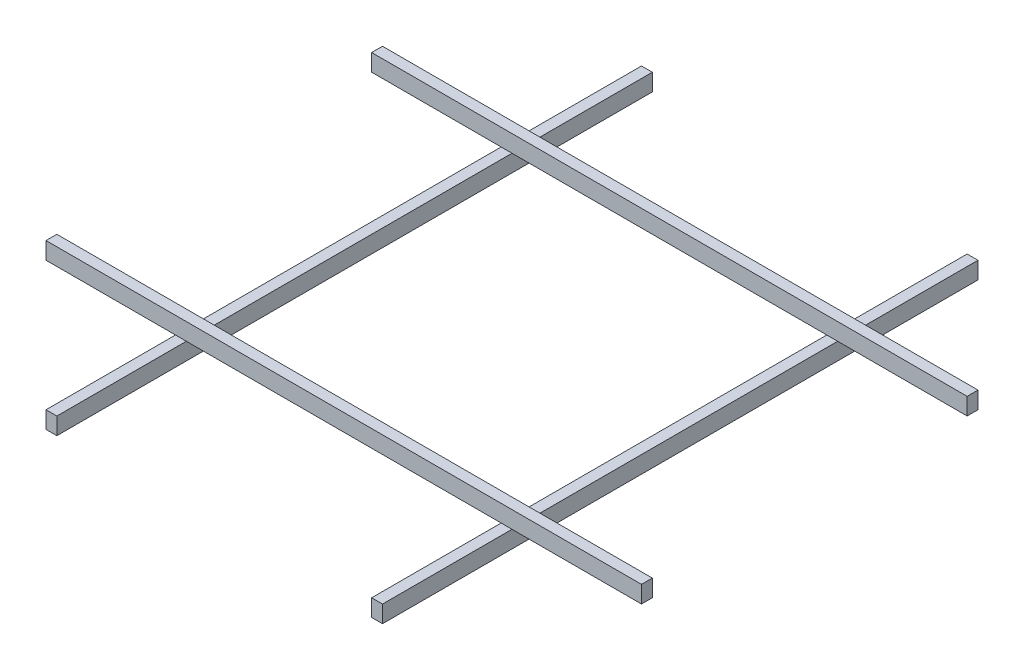
ISO-10303-21;
HEADER;
FILE_DESCRIPTION(('STEP AP214'),'2;1');
FILE_NAME('part.step','',(''),(''),'','','');
FILE_SCHEMA(('AUTOMOTIVE_DESIGN { 1 0 10303 214 1 1 1 1 }'));
ENDSEC;
DATA;
#1=APPLICATION_CONTEXT('core data for automotive mechanical design processes');
#2=APPLICATION_PROTOCOL_DEFINITION('international standard','automotive_design',2000,#1);
#3=PRODUCT_CONTEXT('',#1,'mechanical');
#4=PRODUCT('Part','Part','',(#3));
#5=PRODUCT_RELATED_PRODUCT_CATEGORY('part','',(#4));
#6=PRODUCT_DEFINITION_FORMATION('','',#4);
#7=PRODUCT_DEFINITION_CONTEXT('part definition',#1,'design');
#8=PRODUCT_DEFINITION('design','',#6,#7);
#9=PRODUCT_DEFINITION_SHAPE('','',#8);
#10=(LENGTH_UNIT() NAMED_UNIT(*) SI_UNIT(.MILLI.,.METRE.));
#11=(NAMED_UNIT(*) PLANE_ANGLE_UNIT() SI_UNIT($,.RADIAN.));
#12=(NAMED_UNIT(*) SI_UNIT($,.STERADIAN.) SOLID_ANGLE_UNIT());
#13=UNCERTAINTY_MEASURE_WITH_UNIT(LENGTH_MEASURE(1.E-05),#10,'distance_accuracy_value','');
#14=(GEOMETRIC_REPRESENTATION_CONTEXT(3) GLOBAL_UNCERTAINTY_ASSIGNED_CONTEXT((#13)) GLOBAL_UNIT_ASSIGNED_CONTEXT((#10,
#11,#12)) REPRESENTATION_CONTEXT('',''));
#15=CARTESIAN_POINT('',(0.,0.,0.));
#16=DIRECTION('',(0.,0.,1.));
#17=DIRECTION('',(1.,0.,0.));
#18=AXIS2_PLACEMENT_3D('',#15,#16,#17);
#19=CARTESIAN_POINT('',(4572.,209.55,-1149.35));
#20=DIRECTION('',(0.,0.,1.));
#21=DIRECTION('',(1.,0.,0.));
#22=AXIS2_PLACEMENT_3D('',#19,#20,#21);
#23=PLANE('',#22);
#24=DIRECTION('',(0.,1.,0.));
#25=VECTOR('',#24,1.);
#26=CARTESIAN_POINT('',(-304.8,209.55,-1149.35));
#27=LINE('',#26,#25);
#28=CARTESIAN_POINT('',(-304.8,69.85,-1149.35));
#29=VERTEX_POINT('',#28);
#30=CARTESIAN_POINT('',(-304.8,209.55,-1149.35));
#31=VERTEX_POINT('',#30);
#32=EDGE_CURVE('E137',#29,#31,#27,.T.);
#33=ORIENTED_EDGE('',*,*,#32,.T.);
#34=DIRECTION('',(-1.,0.,0.));
#35=VECTOR('',#34,1.);
#36=CARTESIAN_POINT('',(4572.,209.55,-1149.35));
#37=LINE('',#36,#35);
#38=CARTESIAN_POINT('',(4572.,209.55,-1149.35));
#39=VERTEX_POINT('',#38);
#40=EDGE_CURVE('E13',#39,#31,#37,.T.);
#41=ORIENTED_EDGE('',*,*,#40,.F.);
#42=DIRECTION('',(0.,1.,0.));
#43=VECTOR('',#42,1.);
#44=CARTESIAN_POINT('',(4572.,209.55,-1149.35));
#45=LINE('',#44,#43);
#46=CARTESIAN_POINT('',(4572.,69.85,-1149.35));
#47=VERTEX_POINT('',#46);
#48=EDGE_CURVE('E124',#47,#39,#45,.T.);
#49=ORIENTED_EDGE('',*,*,#48,.F.);
#50=DIRECTION('',(-1.,0.,0.));
#51=VECTOR('',#50,1.);
#52=CARTESIAN_POINT('',(4572.,69.85,-1149.35));
#53=LINE('',#52,#51);
#54=EDGE_CURVE('E133',#47,#29,#53,.T.);
#55=ORIENTED_EDGE('',*,*,#54,.T.);
#56=EDGE_LOOP('',(#33,#41,#49,#55));
#57=FACE_BOUND('',#56,.T.);
#58=ADVANCED_FACE('F72',(#57),#23,.F.);
#59=CARTESIAN_POINT('',(4572.,209.55,-1060.45));
#60=DIRECTION('',(0.,-1.,0.));
#61=DIRECTION('',(0.,0.,-1.));
#62=AXIS2_PLACEMENT_3D('',#59,#60,#61);
#63=PLANE('',#62);
#64=DIRECTION('',(0.,0.,1.));
#65=VECTOR('',#64,1.);
#66=CARTESIAN_POINT('',(-304.8,209.55,-1060.45));
#67=LINE('',#66,#65);
#68=CARTESIAN_POINT('',(-304.8,209.55,-1060.45));
#69=VERTEX_POINT('',#68);
#70=EDGE_CURVE('E128',#31,#69,#67,.T.);
#71=ORIENTED_EDGE('',*,*,#70,.T.);
#72=DIRECTION('',(-1.,0.,0.));
#73=VECTOR('',#72,1.);
#74=CARTESIAN_POINT('',(4572.,209.55,-1060.45));
#75=LINE('',#74,#73);
#76=CARTESIAN_POINT('',(4572.,209.55,-1060.45));
#77=VERTEX_POINT('',#76);
#78=EDGE_CURVE('E81',#77,#69,#75,.T.);
#79=ORIENTED_EDGE('',*,*,#78,.F.);
#80=DIRECTION('',(0.,0.,1.));
#81=VECTOR('',#80,1.);
#82=CARTESIAN_POINT('',(4572.,209.55,-1060.45));
#83=LINE('',#82,#81);
#84=EDGE_CURVE('E119',#39,#77,#83,.T.);
#85=ORIENTED_EDGE('',*,*,#84,.F.);
#86=ORIENTED_EDGE('',*,*,#40,.T.);
#87=EDGE_LOOP('',(#71,#79,#85,#86));
#88=FACE_BOUND('',#87,.T.);
#89=ADVANCED_FACE('F127',(#88),#63,.F.);
#90=CARTESIAN_POINT('',(4572.,209.55,-1060.45));
#91=DIRECTION('',(0.,0.,-1.));
#92=DIRECTION('',(-1.,0.,0.));
#93=AXIS2_PLACEMENT_3D('',#90,#91,#92);
#94=PLANE('',#93);
#95=DIRECTION('',(0.,-1.,0.));
#96=VECTOR('',#95,1.);
#97=CARTESIAN_POINT('',(-304.8,209.55,-1060.45));
#98=LINE('',#97,#96);
#99=CARTESIAN_POINT('',(-304.8,69.85,-1060.45));
#100=VERTEX_POINT('',#99);
#101=EDGE_CURVE('E106',#69,#100,#98,.T.);
#102=ORIENTED_EDGE('',*,*,#101,.T.);
#103=DIRECTION('',(-1.,0.,0.));
#104=VECTOR('',#103,1.);
#105=CARTESIAN_POINT('',(4572.,69.85,-1060.45));
#106=LINE('',#105,#104);
#107=CARTESIAN_POINT('',(4572.,69.85,-1060.45));
#108=VERTEX_POINT('',#107);
#109=EDGE_CURVE('E130',#108,#100,#106,.T.);
#110=ORIENTED_EDGE('',*,*,#109,.F.);
#111=DIRECTION('',(0.,-1.,0.));
#112=VECTOR('',#111,1.);
#113=CARTESIAN_POINT('',(4572.,209.55,-1060.45));
#114=LINE('',#113,#112);
#115=EDGE_CURVE('E122',#77,#108,#114,.T.);
#116=ORIENTED_EDGE('',*,*,#115,.F.);
#117=ORIENTED_EDGE('',*,*,#78,.T.);
#118=EDGE_LOOP('',(#102,#110,#116,#117));
#119=FACE_BOUND('',#118,.T.);
#120=ADVANCED_FACE('F131',(#119),#94,.F.);
#121=CARTESIAN_POINT('',(4572.,69.85,-1060.45));
#122=DIRECTION('',(0.,1.,0.));
#123=DIRECTION('',(0.,0.,1.));
#124=AXIS2_PLACEMENT_3D('',#121,#122,#123);
#125=PLANE('',#124);
#126=DIRECTION('',(0.,0.,-1.));
#127=VECTOR('',#126,1.);
#128=CARTESIAN_POINT('',(-304.8,69.85,-1060.45));
#129=LINE('',#128,#127);
#130=EDGE_CURVE('E112',#100,#29,#129,.T.);
#131=ORIENTED_EDGE('',*,*,#130,.T.);
#132=ORIENTED_EDGE('',*,*,#54,.F.);
#133=DIRECTION('',(0.,0.,-1.));
#134=VECTOR('',#133,1.);
#135=CARTESIAN_POINT('',(4572.,69.85,-1060.45));
#136=LINE('',#135,#134);
#137=EDGE_CURVE('E89',#108,#47,#136,.T.);
#138=ORIENTED_EDGE('',*,*,#137,.F.);
#139=ORIENTED_EDGE('',*,*,#109,.T.);
#140=EDGE_LOOP('',(#131,#132,#138,#139));
#141=FACE_BOUND('',#140,.T.);
#142=ADVANCED_FACE('F146',(#141),#125,.F.);
#143=CARTESIAN_POINT('',(4572.,139.7,-1905.));
#144=DIRECTION('',(1.,0.,0.));
#145=DIRECTION('',(0.,0.,-1.));
#146=AXIS2_PLACEMENT_3D('',#143,#144,#145);
#147=PLANE('',#146);
#148=ORIENTED_EDGE('',*,*,#48,.T.);
#149=ORIENTED_EDGE('',*,*,#84,.T.);
#150=ORIENTED_EDGE('',*,*,#115,.T.);
#151=ORIENTED_EDGE('',*,*,#137,.T.);
#152=EDGE_LOOP('',(#148,#149,#150,#151));
#153=FACE_BOUND('',#152,.T.);
#154=ADVANCED_FACE('F120',(#153),#147,.T.);
#155=CARTESIAN_POINT('',(-304.8,139.7,-1905.));
#156=DIRECTION('',(1.,0.,0.));
#157=DIRECTION('',(0.,0.,-1.));
#158=AXIS2_PLACEMENT_3D('',#155,#156,#157);
#159=PLANE('',#158);
#160=ORIENTED_EDGE('',*,*,#32,.F.);
#161=ORIENTED_EDGE('',*,*,#130,.F.);
#162=ORIENTED_EDGE('',*,*,#101,.F.);
#163=ORIENTED_EDGE('',*,*,#70,.F.);
#164=EDGE_LOOP('',(#160,#161,#162,#163));
#165=FACE_BOUND('',#164,.T.);
#166=ADVANCED_FACE('F149',(#165),#159,.F.);
#167=CLOSED_SHELL('',(#58,#89,#120,#142,#154,#166));
#168=MANIFOLD_SOLID_BREP('B2',#167);
#169=CARTESIAN_POINT('',(4572.,209.55,-3816.35));
#170=DIRECTION('',(0.,0.,1.));
#171=DIRECTION('',(1.,0.,0.));
#172=AXIS2_PLACEMENT_3D('',#169,#170,#171);
#173=PLANE('',#172);
#174=DIRECTION('',(0.,1.,0.));
#175=VECTOR('',#174,1.);
#176=CARTESIAN_POINT('',(-304.8,209.55,-3816.35));
#177=LINE('',#176,#175);
#178=CARTESIAN_POINT('',(-304.8,69.85,-3816.35));
#179=VERTEX_POINT('',#178);
#180=CARTESIAN_POINT('',(-304.8,209.55,-3816.35));
#181=VERTEX_POINT('',#180);
#182=EDGE_CURVE('E301',#179,#181,#177,.T.);
#183=ORIENTED_EDGE('',*,*,#182,.T.);
#184=DIRECTION('',(-1.,0.,0.));
#185=VECTOR('',#184,1.);
#186=CARTESIAN_POINT('',(4572.,209.55,-3816.35));
#187=LINE('',#186,#185);
#188=CARTESIAN_POINT('',(4572.,209.55,-3816.35));
#189=VERTEX_POINT('',#188);
#190=EDGE_CURVE('E70',#189,#181,#187,.T.);
#191=ORIENTED_EDGE('',*,*,#190,.F.);
#192=DIRECTION('',(0.,1.,0.));
#193=VECTOR('',#192,1.);
#194=CARTESIAN_POINT('',(4572.,209.55,-3816.35));
#195=LINE('',#194,#193);
#196=CARTESIAN_POINT('',(4572.,69.85,-3816.35));
#197=VERTEX_POINT('',#196);
#198=EDGE_CURVE('E288',#197,#189,#195,.T.);
#199=ORIENTED_EDGE('',*,*,#198,.F.);
#200=DIRECTION('',(-1.,0.,0.));
#201=VECTOR('',#200,1.);
#202=CARTESIAN_POINT('',(4572.,69.85,-3816.35));
#203=LINE('',#202,#201);
#204=EDGE_CURVE('E297',#197,#179,#203,.T.);
#205=ORIENTED_EDGE('',*,*,#204,.T.);
#206=EDGE_LOOP('',(#183,#191,#199,#205));
#207=FACE_BOUND('',#206,.T.);
#208=ADVANCED_FACE('F236',(#207),#173,.F.);
#209=CARTESIAN_POINT('',(4572.,209.55,-3727.45));
#210=DIRECTION('',(0.,-1.,0.));
#211=DIRECTION('',(0.,0.,-1.));
#212=AXIS2_PLACEMENT_3D('',#209,#210,#211);
#213=PLANE('',#212);
#214=DIRECTION('',(0.,0.,1.));
#215=VECTOR('',#214,1.);
#216=CARTESIAN_POINT('',(-304.8,209.55,-3727.45));
#217=LINE('',#216,#215);
#218=CARTESIAN_POINT('',(-304.8,209.55,-3727.45));
#219=VERTEX_POINT('',#218);
#220=EDGE_CURVE('E292',#181,#219,#217,.T.);
#221=ORIENTED_EDGE('',*,*,#220,.T.);
#222=DIRECTION('',(-1.,0.,0.));
#223=VECTOR('',#222,1.);
#224=CARTESIAN_POINT('',(4572.,209.55,-3727.45));
#225=LINE('',#224,#223);
#226=CARTESIAN_POINT('',(4572.,209.55,-3727.45));
#227=VERTEX_POINT('',#226);
#228=EDGE_CURVE('E245',#227,#219,#225,.T.);
#229=ORIENTED_EDGE('',*,*,#228,.F.);
#230=DIRECTION('',(0.,0.,1.));
#231=VECTOR('',#230,1.);
#232=CARTESIAN_POINT('',(4572.,209.55,-3727.45));
#233=LINE('',#232,#231);
#234=EDGE_CURVE('E283',#189,#227,#233,.T.);
#235=ORIENTED_EDGE('',*,*,#234,.F.);
#236=ORIENTED_EDGE('',*,*,#190,.T.);
#237=EDGE_LOOP('',(#221,#229,#235,#236));
#238=FACE_BOUND('',#237,.T.);
#239=ADVANCED_FACE('F291',(#238),#213,.F.);
#240=CARTESIAN_POINT('',(4572.,209.55,-3727.45));
#241=DIRECTION('',(0.,0.,-1.));
#242=DIRECTION('',(-1.,0.,0.));
#243=AXIS2_PLACEMENT_3D('',#240,#241,#242);
#244=PLANE('',#243);
#245=DIRECTION('',(0.,-1.,0.));
#246=VECTOR('',#245,1.);
#247=CARTESIAN_POINT('',(-304.8,209.55,-3727.45));
#248=LINE('',#247,#246);
#249=CARTESIAN_POINT('',(-304.8,69.85,-3727.45));
#250=VERTEX_POINT('',#249);
#251=EDGE_CURVE('E270',#219,#250,#248,.T.);
#252=ORIENTED_EDGE('',*,*,#251,.T.);
#253=DIRECTION('',(-1.,0.,0.));
#254=VECTOR('',#253,1.);
#255=CARTESIAN_POINT('',(4572.,69.85,-3727.45));
#256=LINE('',#255,#254);
#257=CARTESIAN_POINT('',(4572.,69.85,-3727.45));
#258=VERTEX_POINT('',#257);
#259=EDGE_CURVE('E294',#258,#250,#256,.T.);
#260=ORIENTED_EDGE('',*,*,#259,.F.);
#261=DIRECTION('',(0.,-1.,0.));
#262=VECTOR('',#261,1.);
#263=CARTESIAN_POINT('',(4572.,209.55,-3727.45));
#264=LINE('',#263,#262);
#265=EDGE_CURVE('E286',#227,#258,#264,.T.);
#266=ORIENTED_EDGE('',*,*,#265,.F.);
#267=ORIENTED_EDGE('',*,*,#228,.T.);
#268=EDGE_LOOP('',(#252,#260,#266,#267));
#269=FACE_BOUND('',#268,.T.);
#270=ADVANCED_FACE('F295',(#269),#244,.F.);
#271=CARTESIAN_POINT('',(4572.,69.85,-3727.45));
#272=DIRECTION('',(0.,1.,0.));
#273=DIRECTION('',(0.,0.,1.));
#274=AXIS2_PLACEMENT_3D('',#271,#272,#273);
#275=PLANE('',#274);
#276=DIRECTION('',(0.,0.,-1.));
#277=VECTOR('',#276,1.);
#278=CARTESIAN_POINT('',(-304.8,69.85,-3727.45));
#279=LINE('',#278,#277);
#280=EDGE_CURVE('E276',#250,#179,#279,.T.);
#281=ORIENTED_EDGE('',*,*,#280,.T.);
#282=ORIENTED_EDGE('',*,*,#204,.F.);
#283=DIRECTION('',(0.,0.,-1.));
#284=VECTOR('',#283,1.);
#285=CARTESIAN_POINT('',(4572.,69.85,-3727.45));
#286=LINE('',#285,#284);
#287=EDGE_CURVE('E253',#258,#197,#286,.T.);
#288=ORIENTED_EDGE('',*,*,#287,.F.);
#289=ORIENTED_EDGE('',*,*,#259,.T.);
#290=EDGE_LOOP('',(#281,#282,#288,#289));
#291=FACE_BOUND('',#290,.T.);
#292=ADVANCED_FACE('F308',(#291),#275,.F.);
#293=CARTESIAN_POINT('',(4572.,139.7,-4572.));
#294=DIRECTION('',(1.,0.,0.));
#295=DIRECTION('',(0.,0.,-1.));
#296=AXIS2_PLACEMENT_3D('',#293,#294,#295);
#297=PLANE('',#296);
#298=ORIENTED_EDGE('',*,*,#198,.T.);
#299=ORIENTED_EDGE('',*,*,#234,.T.);
#300=ORIENTED_EDGE('',*,*,#265,.T.);
#301=ORIENTED_EDGE('',*,*,#287,.T.);
#302=EDGE_LOOP('',(#298,#299,#300,#301));
#303=FACE_BOUND('',#302,.T.);
#304=ADVANCED_FACE('F284',(#303),#297,.T.);
#305=CARTESIAN_POINT('',(-304.8,139.7,-4572.));
#306=DIRECTION('',(1.,0.,0.));
#307=DIRECTION('',(0.,0.,-1.));
#308=AXIS2_PLACEMENT_3D('',#305,#306,#307);
#309=PLANE('',#308);
#310=ORIENTED_EDGE('',*,*,#182,.F.);
#311=ORIENTED_EDGE('',*,*,#280,.F.);
#312=ORIENTED_EDGE('',*,*,#251,.F.);
#313=ORIENTED_EDGE('',*,*,#220,.F.);
#314=EDGE_LOOP('',(#310,#311,#312,#313));
#315=FACE_BOUND('',#314,.T.);
#316=ADVANCED_FACE('F311',(#315),#309,.F.);
#317=CLOSED_SHELL('',(#208,#239,#270,#292,#304,#316));
#318=MANIFOLD_SOLID_BREP('B7',#317);
#319=CARTESIAN_POINT('',(3422.65,69.85,-4876.8));
#320=DIRECTION('',(1.,0.,0.));
#321=DIRECTION('',(0.,0.,-1.));
#322=AXIS2_PLACEMENT_3D('',#319,#320,#321);
#323=PLANE('',#322);
#324=DIRECTION('',(0.,1.,0.));
#325=VECTOR('',#324,1.);
#326=CARTESIAN_POINT('',(3422.65,69.85,1.46975985599669E-13));
#327=LINE('',#326,#325);
#328=CARTESIAN_POINT('',(3422.65,-69.85,1.46975985599669E-13));
#329=VERTEX_POINT('',#328);
#330=CARTESIAN_POINT('',(3422.65,69.85,1.46975985599669E-13));
#331=VERTEX_POINT('',#330);
#332=EDGE_CURVE('E458',#329,#331,#327,.T.);
#333=ORIENTED_EDGE('',*,*,#332,.T.);
#334=DIRECTION('',(0.,0.,1.));
#335=VECTOR('',#334,1.);
#336=CARTESIAN_POINT('',(3422.65,69.85,-4876.8));
#337=LINE('',#336,#335);
#338=CARTESIAN_POINT('',(3422.65,69.85,-4876.8));
#339=VERTEX_POINT('',#338);
#340=EDGE_CURVE('E234',#339,#331,#337,.T.);
#341=ORIENTED_EDGE('',*,*,#340,.F.);
#342=DIRECTION('',(0.,1.,0.));
#343=VECTOR('',#342,1.);
#344=CARTESIAN_POINT('',(3422.65,69.85,-4876.8));
#345=LINE('',#344,#343);
#346=CARTESIAN_POINT('',(3422.65,-69.85,-4876.8));
#347=VERTEX_POINT('',#346);
#348=EDGE_CURVE('E446',#347,#339,#345,.T.);
#349=ORIENTED_EDGE('',*,*,#348,.F.);
#350=DIRECTION('',(0.,0.,1.));
#351=VECTOR('',#350,1.);
#352=CARTESIAN_POINT('',(3422.65,-69.85,-4876.8));
#353=LINE('',#352,#351);
#354=EDGE_CURVE('E454',#347,#329,#353,.T.);
#355=ORIENTED_EDGE('',*,*,#354,.T.);
#356=EDGE_LOOP('',(#333,#341,#349,#355));
#357=FACE_BOUND('',#356,.T.);
#358=ADVANCED_FACE('F395',(#357),#323,.F.);
#359=CARTESIAN_POINT('',(3511.55,69.85,-4876.8));
#360=DIRECTION('',(0.,-1.,0.));
#361=DIRECTION('',(0.,0.,-1.));
#362=AXIS2_PLACEMENT_3D('',#359,#360,#361);
#363=PLANE('',#362);
#364=DIRECTION('',(1.,0.,0.));
#365=VECTOR('',#364,1.);
#366=CARTESIAN_POINT('',(3511.55,69.85,1.46975985599669E-13));
#367=LINE('',#366,#365);
#368=CARTESIAN_POINT('',(3511.55,69.85,1.46975985599669E-13));
#369=VERTEX_POINT('',#368);
#370=EDGE_CURVE('E450',#331,#369,#367,.T.);
#371=ORIENTED_EDGE('',*,*,#370,.T.);
#372=DIRECTION('',(0.,0.,1.));
#373=VECTOR('',#372,1.);
#374=CARTESIAN_POINT('',(3511.55,69.85,-4876.8));
#375=LINE('',#374,#373);
#376=CARTESIAN_POINT('',(3511.55,69.85,-4876.8));
#377=VERTEX_POINT('',#376);
#378=EDGE_CURVE('E403',#377,#369,#375,.T.);
#379=ORIENTED_EDGE('',*,*,#378,.F.);
#380=DIRECTION('',(1.,0.,0.));
#381=VECTOR('',#380,1.);
#382=CARTESIAN_POINT('',(3511.55,69.85,-4876.8));
#383=LINE('',#382,#381);
#384=EDGE_CURVE('E441',#339,#377,#383,.T.);
#385=ORIENTED_EDGE('',*,*,#384,.F.);
#386=ORIENTED_EDGE('',*,*,#340,.T.);
#387=EDGE_LOOP('',(#371,#379,#385,#386));
#388=FACE_BOUND('',#387,.T.);
#389=ADVANCED_FACE('F449',(#388),#363,.F.);
#390=CARTESIAN_POINT('',(3511.55,69.85,-4876.8));
#391=DIRECTION('',(-1.,0.,0.));
#392=DIRECTION('',(0.,0.,1.));
#393=AXIS2_PLACEMENT_3D('',#390,#391,#392);
#394=PLANE('',#393);
#395=DIRECTION('',(0.,-1.,0.));
#396=VECTOR('',#395,1.);
#397=CARTESIAN_POINT('',(3511.55,69.85,1.46975985599669E-13));
#398=LINE('',#397,#396);
#399=CARTESIAN_POINT('',(3511.55,-69.85,1.46975985599669E-13));
#400=VERTEX_POINT('',#399);
#401=EDGE_CURVE('E428',#369,#400,#398,.T.);
#402=ORIENTED_EDGE('',*,*,#401,.T.);
#403=DIRECTION('',(0.,0.,1.));
#404=VECTOR('',#403,1.);
#405=CARTESIAN_POINT('',(3511.55,-69.85,-4876.8));
#406=LINE('',#405,#404);
#407=CARTESIAN_POINT('',(3511.55,-69.85,-4876.8));
#408=VERTEX_POINT('',#407);
#409=EDGE_CURVE('E451',#408,#400,#406,.T.);
#410=ORIENTED_EDGE('',*,*,#409,.F.);
#411=DIRECTION('',(0.,-1.,0.));
#412=VECTOR('',#411,1.);
#413=CARTESIAN_POINT('',(3511.55,69.85,-4876.8));
#414=LINE('',#413,#412);
#415=EDGE_CURVE('E444',#377,#408,#414,.T.);
#416=ORIENTED_EDGE('',*,*,#415,.F.);
#417=ORIENTED_EDGE('',*,*,#378,.T.);
#418=EDGE_LOOP('',(#402,#410,#416,#417));
#419=FACE_BOUND('',#418,.T.);
#420=ADVANCED_FACE('F452',(#419),#394,.F.);
#421=CARTESIAN_POINT('',(3511.55,-69.85,-4876.8));
#422=DIRECTION('',(0.,1.,0.));
#423=DIRECTION('',(0.,0.,1.));
#424=AXIS2_PLACEMENT_3D('',#421,#422,#423);
#425=PLANE('',#424);
#426=DIRECTION('',(-1.,0.,0.));
#427=VECTOR('',#426,1.);
#428=CARTESIAN_POINT('',(3511.55,-69.85,1.46975985599669E-13));
#429=LINE('',#428,#427);
#430=EDGE_CURVE('E434',#400,#329,#429,.T.);
#431=ORIENTED_EDGE('',*,*,#430,.T.);
#432=ORIENTED_EDGE('',*,*,#354,.F.);
#433=DIRECTION('',(-1.,0.,0.));
#434=VECTOR('',#433,1.);
#435=CARTESIAN_POINT('',(3511.55,-69.85,-4876.8));
#436=LINE('',#435,#434);
#437=EDGE_CURVE('E411',#408,#347,#436,.T.);
#438=ORIENTED_EDGE('',*,*,#437,.F.);
#439=ORIENTED_EDGE('',*,*,#409,.T.);
#440=EDGE_LOOP('',(#431,#432,#438,#439));
#441=FACE_BOUND('',#440,.T.);
#442=ADVANCED_FACE('F465',(#441),#425,.F.);
#443=CARTESIAN_POINT('',(2667.,0.,-4876.8));
#444=DIRECTION('',(0.,0.,-1.));
#445=DIRECTION('',(-1.,0.,0.));
#446=AXIS2_PLACEMENT_3D('',#443,#444,#445);
#447=PLANE('',#446);
#448=ORIENTED_EDGE('',*,*,#348,.T.);
#449=ORIENTED_EDGE('',*,*,#384,.T.);
#450=ORIENTED_EDGE('',*,*,#415,.T.);
#451=ORIENTED_EDGE('',*,*,#437,.T.);
#452=EDGE_LOOP('',(#448,#449,#450,#451));
#453=FACE_BOUND('',#452,.T.);
#454=ADVANCED_FACE('F442',(#453),#447,.T.);
#455=CARTESIAN_POINT('',(2667.,0.,1.46975985599669E-13));
#456=DIRECTION('',(0.,0.,-1.));
#457=DIRECTION('',(-1.,0.,0.));
#458=AXIS2_PLACEMENT_3D('',#455,#456,#457);
#459=PLANE('',#458);
#460=ORIENTED_EDGE('',*,*,#332,.F.);
#461=ORIENTED_EDGE('',*,*,#430,.F.);
#462=ORIENTED_EDGE('',*,*,#401,.F.);
#463=ORIENTED_EDGE('',*,*,#370,.F.);
#464=EDGE_LOOP('',(#460,#461,#462,#463));
#465=FACE_BOUND('',#464,.T.);
#466=ADVANCED_FACE('F468',(#465),#459,.F.);
#467=CLOSED_SHELL('',(#358,#389,#420,#442,#454,#466));
#468=MANIFOLD_SOLID_BREP('B64',#467);
#469=CARTESIAN_POINT('',(755.65,69.85,-4876.8));
#470=DIRECTION('',(1.,0.,0.));
#471=DIRECTION('',(0.,0.,-1.));
#472=AXIS2_PLACEMENT_3D('',#469,#470,#471);
#473=PLANE('',#472);
#474=DIRECTION('',(0.,1.,0.));
#475=VECTOR('',#474,1.);
#476=CARTESIAN_POINT('',(755.65,69.85,8.88178419700125E-13));
#477=LINE('',#476,#475);
#478=CARTESIAN_POINT('',(755.65,-69.85,8.88178419700125E-13));
#479=VERTEX_POINT('',#478);
#480=CARTESIAN_POINT('',(755.65,69.85,8.88178419700125E-13));
#481=VERTEX_POINT('',#480);
#482=EDGE_CURVE('E612',#479,#481,#477,.T.);
#483=ORIENTED_EDGE('',*,*,#482,.T.);
#484=DIRECTION('',(0.,0.,1.));
#485=VECTOR('',#484,1.);
#486=CARTESIAN_POINT('',(755.65,69.85,-4876.8));
#487=LINE('',#486,#485);
#488=CARTESIAN_POINT('',(755.65,69.85,-4876.8));
#489=VERTEX_POINT('',#488);
#490=EDGE_CURVE('E393',#489,#481,#487,.T.);
#491=ORIENTED_EDGE('',*,*,#490,.F.);
#492=DIRECTION('',(0.,1.,0.));
#493=VECTOR('',#492,1.);
#494=CARTESIAN_POINT('',(755.65,69.85,-4876.8));
#495=LINE('',#494,#493);
#496=CARTESIAN_POINT('',(755.65,-69.85,-4876.8));
#497=VERTEX_POINT('',#496);
#498=EDGE_CURVE('E599',#497,#489,#495,.T.);
#499=ORIENTED_EDGE('',*,*,#498,.F.);
#500=DIRECTION('',(0.,0.,1.));
#501=VECTOR('',#500,1.);
#502=CARTESIAN_POINT('',(755.65,-69.85,-4876.8));
#503=LINE('',#502,#501);
#504=EDGE_CURVE('E608',#497,#479,#503,.T.);
#505=ORIENTED_EDGE('',*,*,#504,.T.);
#506=EDGE_LOOP('',(#483,#491,#499,#505));
#507=FACE_BOUND('',#506,.T.);
#508=ADVANCED_FACE('F543',(#507),#473,.F.);
#509=CARTESIAN_POINT('',(844.55,69.85,-4876.8));
#510=DIRECTION('',(0.,-1.,0.));
#511=DIRECTION('',(0.,0.,-1.));
#512=AXIS2_PLACEMENT_3D('',#509,#510,#511);
#513=PLANE('',#512);
#514=DIRECTION('',(1.,0.,0.));
#515=VECTOR('',#514,1.);
#516=CARTESIAN_POINT('',(844.55,69.85,8.88178419700125E-13));
#517=LINE('',#516,#515);
#518=CARTESIAN_POINT('',(844.55,69.85,8.88178419700125E-13));
#519=VERTEX_POINT('',#518);
#520=EDGE_CURVE('E603',#481,#519,#517,.T.);
#521=ORIENTED_EDGE('',*,*,#520,.T.);
#522=DIRECTION('',(0.,0.,1.));
#523=VECTOR('',#522,1.);
#524=CARTESIAN_POINT('',(844.55,69.85,-4876.8));
#525=LINE('',#524,#523);
#526=CARTESIAN_POINT('',(844.55,69.85,-4876.8));
#527=VERTEX_POINT('',#526);
#528=EDGE_CURVE('E552',#527,#519,#525,.T.);
#529=ORIENTED_EDGE('',*,*,#528,.F.);
#530=DIRECTION('',(1.,0.,0.));
#531=VECTOR('',#530,1.);
#532=CARTESIAN_POINT('',(844.55,69.85,-4876.8));
#533=LINE('',#532,#531);
#534=EDGE_CURVE('E594',#489,#527,#533,.T.);
#535=ORIENTED_EDGE('',*,*,#534,.F.);
#536=ORIENTED_EDGE('',*,*,#490,.T.);
#537=EDGE_LOOP('',(#521,#529,#535,#536));
#538=FACE_BOUND('',#537,.T.);
#539=ADVANCED_FACE('F602',(#538),#513,.F.);
#540=CARTESIAN_POINT('',(844.55,69.85,-4876.8));
#541=DIRECTION('',(-1.,0.,0.));
#542=DIRECTION('',(0.,0.,1.));
#543=AXIS2_PLACEMENT_3D('',#540,#541,#542);
#544=PLANE('',#543);
#545=DIRECTION('',(0.,-1.,0.));
#546=VECTOR('',#545,1.);
#547=CARTESIAN_POINT('',(844.55,69.85,8.88178419700125E-13));
#548=LINE('',#547,#546);
#549=CARTESIAN_POINT('',(844.55,-69.85,8.88178419700125E-13));
#550=VERTEX_POINT('',#549);
#551=EDGE_CURVE('E580',#519,#550,#548,.T.);
#552=ORIENTED_EDGE('',*,*,#551,.T.);
#553=DIRECTION('',(0.,0.,1.));
#554=VECTOR('',#553,1.);
#555=CARTESIAN_POINT('',(844.55,-69.85,-4876.8));
#556=LINE('',#555,#554);
#557=CARTESIAN_POINT('',(844.55,-69.85,-4876.8));
#558=VERTEX_POINT('',#557);
#559=EDGE_CURVE('E605',#558,#550,#556,.T.);
#560=ORIENTED_EDGE('',*,*,#559,.F.);
#561=DIRECTION('',(0.,-1.,0.));
#562=VECTOR('',#561,1.);
#563=CARTESIAN_POINT('',(844.55,69.85,-4876.8));
#564=LINE('',#563,#562);
#565=EDGE_CURVE('E597',#527,#558,#564,.T.);
#566=ORIENTED_EDGE('',*,*,#565,.F.);
#567=ORIENTED_EDGE('',*,*,#528,.T.);
#568=EDGE_LOOP('',(#552,#560,#566,#567));
#569=FACE_BOUND('',#568,.T.);
#570=ADVANCED_FACE('F606',(#569),#544,.F.);
#571=CARTESIAN_POINT('',(844.55,-69.85,-4876.8));
#572=DIRECTION('',(0.,1.,0.));
#573=DIRECTION('',(0.,0.,1.));
#574=AXIS2_PLACEMENT_3D('',#571,#572,#573);
#575=PLANE('',#574);
#576=DIRECTION('',(-1.,0.,0.));
#577=VECTOR('',#576,1.);
#578=CARTESIAN_POINT('',(844.55,-69.85,8.88178419700125E-13));
#579=LINE('',#578,#577);
#580=EDGE_CURVE('E587',#550,#479,#579,.T.);
#581=ORIENTED_EDGE('',*,*,#580,.T.);
#582=ORIENTED_EDGE('',*,*,#504,.F.);
#583=DIRECTION('',(-1.,0.,0.));
#584=VECTOR('',#583,1.);
#585=CARTESIAN_POINT('',(844.55,-69.85,-4876.8));
#586=LINE('',#585,#584);
#587=EDGE_CURVE('E560',#558,#497,#586,.T.);
#588=ORIENTED_EDGE('',*,*,#587,.F.);
#589=ORIENTED_EDGE('',*,*,#559,.T.);
#590=EDGE_LOOP('',(#581,#582,#588,#589));
#591=FACE_BOUND('',#590,.T.);
#592=ADVANCED_FACE('F625',(#591),#575,.F.);
#593=CARTESIAN_POINT('',(0.,0.,-4876.8));
#594=DIRECTION('',(0.,0.,-1.));
#595=DIRECTION('',(-1.,0.,0.));
#596=AXIS2_PLACEMENT_3D('',#593,#594,#595);
#597=PLANE('',#596);
#598=ORIENTED_EDGE('',*,*,#498,.T.);
#599=ORIENTED_EDGE('',*,*,#534,.T.);
#600=ORIENTED_EDGE('',*,*,#565,.T.);
#601=ORIENTED_EDGE('',*,*,#587,.T.);
#602=EDGE_LOOP('',(#598,#599,#600,#601));
#603=FACE_BOUND('',#602,.T.);
#604=ADVANCED_FACE('F595',(#603),#597,.T.);
#605=CARTESIAN_POINT('',(0.,0.,8.88178419700125E-13));
#606=DIRECTION('',(0.,0.,-1.));
#607=DIRECTION('',(-1.,0.,0.));
#608=AXIS2_PLACEMENT_3D('',#605,#606,#607);
#609=PLANE('',#608);
#610=ORIENTED_EDGE('',*,*,#482,.F.);
#611=ORIENTED_EDGE('',*,*,#580,.F.);
#612=ORIENTED_EDGE('',*,*,#551,.F.);
#613=ORIENTED_EDGE('',*,*,#520,.F.);
#614=EDGE_LOOP('',(#610,#611,#612,#613));
#615=FACE_BOUND('',#614,.T.);
#616=ADVANCED_FACE('F628',(#615),#609,.F.);
#617=CLOSED_SHELL('',(#508,#539,#570,#592,#604,#616));
#618=MANIFOLD_SOLID_BREP('B228',#617);
#619=ADVANCED_BREP_SHAPE_REPRESENTATION('',(#18,#168,#318,#468,#618),#14);
#620=SHAPE_DEFINITION_REPRESENTATION(#9,#619);
ENDSEC;
END-ISO-10303-21;
